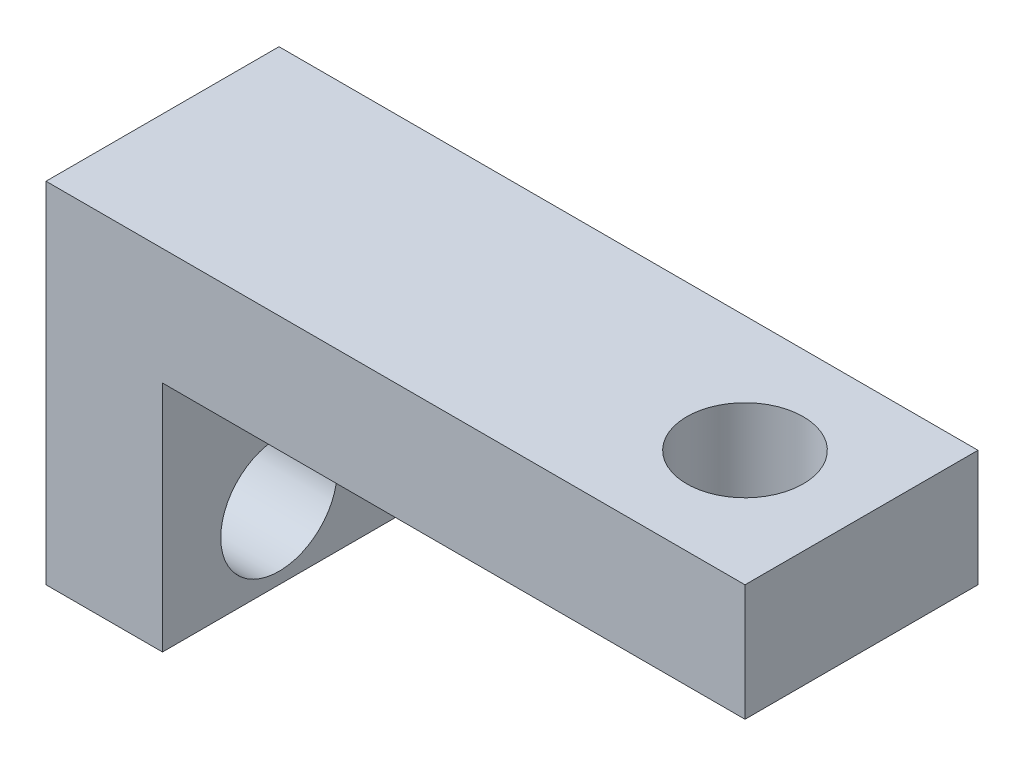
ISO-10303-21;
HEADER;
FILE_DESCRIPTION(('STEP AP214'),'2;1');
FILE_NAME('part.step','',(''),(''),'','','');
FILE_SCHEMA(('AUTOMOTIVE_DESIGN { 1 0 10303 214 1 1 1 1 }'));
ENDSEC;
DATA;
#1=APPLICATION_CONTEXT('core data for automotive mechanical design processes');
#2=APPLICATION_PROTOCOL_DEFINITION('international standard','automotive_design',2000,#1);
#3=PRODUCT_CONTEXT('',#1,'mechanical');
#4=PRODUCT('Part','Part','',(#3));
#5=PRODUCT_RELATED_PRODUCT_CATEGORY('part','',(#4));
#6=PRODUCT_DEFINITION_FORMATION('','',#4);
#7=PRODUCT_DEFINITION_CONTEXT('part definition',#1,'design');
#8=PRODUCT_DEFINITION('design','',#6,#7);
#9=PRODUCT_DEFINITION_SHAPE('','',#8);
#10=(LENGTH_UNIT() NAMED_UNIT(*) SI_UNIT(.MILLI.,.METRE.));
#11=(NAMED_UNIT(*) PLANE_ANGLE_UNIT() SI_UNIT($,.RADIAN.));
#12=(NAMED_UNIT(*) SI_UNIT($,.STERADIAN.) SOLID_ANGLE_UNIT());
#13=UNCERTAINTY_MEASURE_WITH_UNIT(LENGTH_MEASURE(1.E-05),#10,'distance_accuracy_value','');
#14=(GEOMETRIC_REPRESENTATION_CONTEXT(3) GLOBAL_UNCERTAINTY_ASSIGNED_CONTEXT((#13)) GLOBAL_UNIT_ASSIGNED_CONTEXT((#10,
#11,#12)) REPRESENTATION_CONTEXT('',''));
#15=CARTESIAN_POINT('',(0.,0.,0.));
#16=DIRECTION('',(0.,0.,1.));
#17=DIRECTION('',(1.,0.,0.));
#18=AXIS2_PLACEMENT_3D('',#15,#16,#17);
#19=CARTESIAN_POINT('',(0.,30.,-10.));
#20=DIRECTION('',(-1.,0.,0.));
#21=DIRECTION('',(0.,0.,1.));
#22=AXIS2_PLACEMENT_3D('',#19,#20,#21);
#23=PLANE('',#22);
#24=CARTESIAN_POINT('',(0.,6.,0.));
#25=DIRECTION('',(-1.,0.,0.));
#26=DIRECTION('',(0.,0.,1.));
#27=AXIS2_PLACEMENT_3D('',#24,#25,#26);
#28=CIRCLE('',#27,5.);
#29=CARTESIAN_POINT('',(0.,6.,5.));
#30=VERTEX_POINT('',#29);
#31=EDGE_CURVE('E192',#30,#30,#28,.T.);
#32=ORIENTED_EDGE('',*,*,#31,.F.);
#33=EDGE_LOOP('',(#32));
#34=FACE_BOUND('',#33,.T.);
#35=DIRECTION('',(0.,0.,1.));
#36=VECTOR('',#35,1.);
#37=CARTESIAN_POINT('',(0.,0.,-10.));
#38=LINE('',#37,#36);
#39=CARTESIAN_POINT('',(0.,0.,-10.));
#40=VERTEX_POINT('',#39);
#41=CARTESIAN_POINT('',(0.,0.,10.));
#42=VERTEX_POINT('',#41);
#43=EDGE_CURVE('E35',#40,#42,#38,.T.);
#44=ORIENTED_EDGE('',*,*,#43,.T.);
#45=DIRECTION('',(0.,-1.,0.));
#46=VECTOR('',#45,1.);
#47=CARTESIAN_POINT('',(0.,30.,10.));
#48=LINE('',#47,#46);
#49=CARTESIAN_POINT('',(0.,30.,10.));
#50=VERTEX_POINT('',#49);
#51=EDGE_CURVE('E84',#50,#42,#48,.T.);
#52=ORIENTED_EDGE('',*,*,#51,.F.);
#53=DIRECTION('',(0.,0.,1.));
#54=VECTOR('',#53,1.);
#55=CARTESIAN_POINT('',(0.,30.,-10.));
#56=LINE('',#55,#54);
#57=CARTESIAN_POINT('',(0.,30.,-10.));
#58=VERTEX_POINT('',#57);
#59=EDGE_CURVE('E11',#58,#50,#56,.T.);
#60=ORIENTED_EDGE('',*,*,#59,.F.);
#61=DIRECTION('',(0.,-1.,0.));
#62=VECTOR('',#61,1.);
#63=CARTESIAN_POINT('',(0.,30.,-10.));
#64=LINE('',#63,#62);
#65=EDGE_CURVE('E85',#58,#40,#64,.T.);
#66=ORIENTED_EDGE('',*,*,#65,.T.);
#67=EDGE_LOOP('',(#44,#52,#60,#66));
#68=FACE_BOUND('',#67,.T.);
#69=ADVANCED_FACE('F32',(#34,#68),#23,.T.);
#70=CARTESIAN_POINT('',(60.,30.,-10.));
#71=DIRECTION('',(0.,1.,0.));
#72=DIRECTION('',(-1.,0.,0.));
#73=AXIS2_PLACEMENT_3D('',#70,#71,#72);
#74=PLANE('',#73);
#75=CARTESIAN_POINT('',(50.,30.,0.));
#76=DIRECTION('',(0.,-1.,0.));
#77=DIRECTION('',(0.,0.,-1.));
#78=AXIS2_PLACEMENT_3D('',#75,#76,#77);
#79=CIRCLE('',#78,5.);
#80=CARTESIAN_POINT('',(50.,30.,-5.));
#81=VERTEX_POINT('',#80);
#82=EDGE_CURVE('E103',#81,#81,#79,.T.);
#83=ORIENTED_EDGE('',*,*,#82,.T.);
#84=EDGE_LOOP('',(#83));
#85=FACE_BOUND('',#84,.T.);
#86=ORIENTED_EDGE('',*,*,#59,.T.);
#87=DIRECTION('',(-1.,0.,0.));
#88=VECTOR('',#87,1.);
#89=CARTESIAN_POINT('',(60.,30.,10.));
#90=LINE('',#89,#88);
#91=CARTESIAN_POINT('',(60.,30.,10.));
#92=VERTEX_POINT('',#91);
#93=EDGE_CURVE('E102',#92,#50,#90,.T.);
#94=ORIENTED_EDGE('',*,*,#93,.F.);
#95=DIRECTION('',(0.,0.,1.));
#96=VECTOR('',#95,1.);
#97=CARTESIAN_POINT('',(60.,30.,-10.));
#98=LINE('',#97,#96);
#99=CARTESIAN_POINT('',(60.,30.,-10.));
#100=VERTEX_POINT('',#99);
#101=EDGE_CURVE('E40',#100,#92,#98,.T.);
#102=ORIENTED_EDGE('',*,*,#101,.F.);
#103=DIRECTION('',(-1.,0.,0.));
#104=VECTOR('',#103,1.);
#105=CARTESIAN_POINT('',(60.,30.,-10.));
#106=LINE('',#105,#104);
#107=EDGE_CURVE('E90',#100,#58,#106,.T.);
#108=ORIENTED_EDGE('',*,*,#107,.T.);
#109=EDGE_LOOP('',(#86,#94,#102,#108));
#110=FACE_BOUND('',#109,.T.);
#111=ADVANCED_FACE('F147',(#85,#110),#74,.T.);
#112=CARTESIAN_POINT('',(60.,20.,-10.));
#113=DIRECTION('',(1.,0.,0.));
#114=DIRECTION('',(0.,0.,-1.));
#115=AXIS2_PLACEMENT_3D('',#112,#113,#114);
#116=PLANE('',#115);
#117=ORIENTED_EDGE('',*,*,#101,.T.);
#118=DIRECTION('',(0.,1.,0.));
#119=VECTOR('',#118,1.);
#120=CARTESIAN_POINT('',(60.,20.,10.));
#121=LINE('',#120,#119);
#122=CARTESIAN_POINT('',(60.,20.,10.));
#123=VERTEX_POINT('',#122);
#124=EDGE_CURVE('E114',#123,#92,#121,.T.);
#125=ORIENTED_EDGE('',*,*,#124,.F.);
#126=DIRECTION('',(0.,0.,1.));
#127=VECTOR('',#126,1.);
#128=CARTESIAN_POINT('',(60.,20.,-10.));
#129=LINE('',#128,#127);
#130=CARTESIAN_POINT('',(60.,20.,-10.));
#131=VERTEX_POINT('',#130);
#132=EDGE_CURVE('E130',#131,#123,#129,.T.);
#133=ORIENTED_EDGE('',*,*,#132,.F.);
#134=DIRECTION('',(0.,1.,0.));
#135=VECTOR('',#134,1.);
#136=CARTESIAN_POINT('',(60.,20.,-10.));
#137=LINE('',#136,#135);
#138=EDGE_CURVE('E126',#131,#100,#137,.T.);
#139=ORIENTED_EDGE('',*,*,#138,.T.);
#140=EDGE_LOOP('',(#117,#125,#133,#139));
#141=FACE_BOUND('',#140,.T.);
#142=ADVANCED_FACE('F143',(#141),#116,.T.);
#143=CARTESIAN_POINT('',(10.,20.,-10.));
#144=DIRECTION('',(0.,-1.,0.));
#145=DIRECTION('',(0.,0.,-1.));
#146=AXIS2_PLACEMENT_3D('',#143,#144,#145);
#147=PLANE('',#146);
#148=CARTESIAN_POINT('',(50.,20.,0.));
#149=DIRECTION('',(0.,-1.,0.));
#150=DIRECTION('',(0.,0.,-1.));
#151=AXIS2_PLACEMENT_3D('',#148,#149,#150);
#152=CIRCLE('',#151,5.);
#153=CARTESIAN_POINT('',(50.,20.,-5.));
#154=VERTEX_POINT('',#153);
#155=EDGE_CURVE('E106',#154,#154,#152,.T.);
#156=ORIENTED_EDGE('',*,*,#155,.F.);
#157=EDGE_LOOP('',(#156));
#158=FACE_BOUND('',#157,.T.);
#159=ORIENTED_EDGE('',*,*,#132,.T.);
#160=DIRECTION('',(1.,0.,0.));
#161=VECTOR('',#160,1.);
#162=CARTESIAN_POINT('',(10.,20.,10.));
#163=LINE('',#162,#161);
#164=CARTESIAN_POINT('',(10.,20.,10.));
#165=VERTEX_POINT('',#164);
#166=EDGE_CURVE('E111',#165,#123,#163,.T.);
#167=ORIENTED_EDGE('',*,*,#166,.F.);
#168=DIRECTION('',(0.,0.,1.));
#169=VECTOR('',#168,1.);
#170=CARTESIAN_POINT('',(10.,20.,-10.));
#171=LINE('',#170,#169);
#172=CARTESIAN_POINT('',(10.,20.,-10.));
#173=VERTEX_POINT('',#172);
#174=EDGE_CURVE('E132',#173,#165,#171,.T.);
#175=ORIENTED_EDGE('',*,*,#174,.F.);
#176=DIRECTION('',(1.,0.,0.));
#177=VECTOR('',#176,1.);
#178=CARTESIAN_POINT('',(10.,20.,-10.));
#179=LINE('',#178,#177);
#180=EDGE_CURVE('E123',#173,#131,#179,.T.);
#181=ORIENTED_EDGE('',*,*,#180,.T.);
#182=EDGE_LOOP('',(#159,#167,#175,#181));
#183=FACE_BOUND('',#182,.T.);
#184=ADVANCED_FACE('F140',(#158,#183),#147,.T.);
#185=CARTESIAN_POINT('',(10.,0.,-10.));
#186=DIRECTION('',(1.,0.,0.));
#187=DIRECTION('',(0.,0.,-1.));
#188=AXIS2_PLACEMENT_3D('',#185,#186,#187);
#189=PLANE('',#188);
#190=CARTESIAN_POINT('',(10.,6.,0.));
#191=DIRECTION('',(-1.,0.,0.));
#192=DIRECTION('',(0.,0.,1.));
#193=AXIS2_PLACEMENT_3D('',#190,#191,#192);
#194=CIRCLE('',#193,5.);
#195=CARTESIAN_POINT('',(10.,6.,5.));
#196=VERTEX_POINT('',#195);
#197=EDGE_CURVE('E189',#196,#196,#194,.T.);
#198=ORIENTED_EDGE('',*,*,#197,.T.);
#199=EDGE_LOOP('',(#198));
#200=FACE_BOUND('',#199,.T.);
#201=ORIENTED_EDGE('',*,*,#174,.T.);
#202=DIRECTION('',(0.,1.,0.));
#203=VECTOR('',#202,1.);
#204=CARTESIAN_POINT('',(10.,0.,10.));
#205=LINE('',#204,#203);
#206=CARTESIAN_POINT('',(10.,0.,10.));
#207=VERTEX_POINT('',#206);
#208=EDGE_CURVE('E97',#207,#165,#205,.T.);
#209=ORIENTED_EDGE('',*,*,#208,.F.);
#210=DIRECTION('',(0.,0.,1.));
#211=VECTOR('',#210,1.);
#212=CARTESIAN_POINT('',(10.,0.,-10.));
#213=LINE('',#212,#211);
#214=CARTESIAN_POINT('',(10.,0.,-10.));
#215=VERTEX_POINT('',#214);
#216=EDGE_CURVE('E89',#215,#207,#213,.T.);
#217=ORIENTED_EDGE('',*,*,#216,.F.);
#218=DIRECTION('',(0.,1.,0.));
#219=VECTOR('',#218,1.);
#220=CARTESIAN_POINT('',(10.,0.,-10.));
#221=LINE('',#220,#219);
#222=EDGE_CURVE('E120',#215,#173,#221,.T.);
#223=ORIENTED_EDGE('',*,*,#222,.T.);
#224=EDGE_LOOP('',(#201,#209,#217,#223));
#225=FACE_BOUND('',#224,.T.);
#226=ADVANCED_FACE('F134',(#200,#225),#189,.T.);
#227=CARTESIAN_POINT('',(0.,0.,-10.));
#228=DIRECTION('',(0.,-1.,0.));
#229=DIRECTION('',(0.,0.,-1.));
#230=AXIS2_PLACEMENT_3D('',#227,#228,#229);
#231=PLANE('',#230);
#232=ORIENTED_EDGE('',*,*,#216,.T.);
#233=DIRECTION('',(1.,0.,0.));
#234=VECTOR('',#233,1.);
#235=CARTESIAN_POINT('',(0.,0.,10.));
#236=LINE('',#235,#234);
#237=EDGE_CURVE('E92',#42,#207,#236,.T.);
#238=ORIENTED_EDGE('',*,*,#237,.F.);
#239=ORIENTED_EDGE('',*,*,#43,.F.);
#240=DIRECTION('',(1.,0.,0.));
#241=VECTOR('',#240,1.);
#242=CARTESIAN_POINT('',(0.,0.,-10.));
#243=LINE('',#242,#241);
#244=EDGE_CURVE('E118',#40,#215,#243,.T.);
#245=ORIENTED_EDGE('',*,*,#244,.T.);
#246=EDGE_LOOP('',(#232,#238,#239,#245));
#247=FACE_BOUND('',#246,.T.);
#248=ADVANCED_FACE('F93',(#247),#231,.T.);
#249=CARTESIAN_POINT('',(0.,0.,-10.));
#250=DIRECTION('',(0.,0.,1.));
#251=DIRECTION('',(1.,0.,0.));
#252=AXIS2_PLACEMENT_3D('',#249,#250,#251);
#253=PLANE('',#252);
#254=ORIENTED_EDGE('',*,*,#65,.F.);
#255=ORIENTED_EDGE('',*,*,#107,.F.);
#256=ORIENTED_EDGE('',*,*,#138,.F.);
#257=ORIENTED_EDGE('',*,*,#180,.F.);
#258=ORIENTED_EDGE('',*,*,#222,.F.);
#259=ORIENTED_EDGE('',*,*,#244,.F.);
#260=EDGE_LOOP('',(#254,#255,#256,#257,#258,#259));
#261=FACE_BOUND('',#260,.T.);
#262=ADVANCED_FACE('F146',(#261),#253,.F.);
#263=CARTESIAN_POINT('',(0.,0.,10.));
#264=DIRECTION('',(0.,0.,1.));
#265=DIRECTION('',(1.,0.,0.));
#266=AXIS2_PLACEMENT_3D('',#263,#264,#265);
#267=PLANE('',#266);
#268=ORIENTED_EDGE('',*,*,#51,.T.);
#269=ORIENTED_EDGE('',*,*,#237,.T.);
#270=ORIENTED_EDGE('',*,*,#208,.T.);
#271=ORIENTED_EDGE('',*,*,#166,.T.);
#272=ORIENTED_EDGE('',*,*,#124,.T.);
#273=ORIENTED_EDGE('',*,*,#93,.T.);
#274=EDGE_LOOP('',(#268,#269,#270,#271,#272,#273));
#275=FACE_BOUND('',#274,.T.);
#276=ADVANCED_FACE('F100',(#275),#267,.T.);
#277=CARTESIAN_POINT('',(50.,30.,0.));
#278=DIRECTION('',(0.,-1.,0.));
#279=DIRECTION('',(0.,0.,-1.));
#280=AXIS2_PLACEMENT_3D('',#277,#278,#279);
#281=CYLINDRICAL_SURFACE('',#280,5.);
#282=ORIENTED_EDGE('',*,*,#82,.F.);
#283=EDGE_LOOP('',(#282));
#284=FACE_BOUND('',#283,.T.);
#285=ORIENTED_EDGE('',*,*,#155,.T.);
#286=EDGE_LOOP('',(#285));
#287=FACE_BOUND('',#286,.T.);
#288=ADVANCED_FACE('F174',(#284,#287),#281,.F.);
#289=CARTESIAN_POINT('',(10.,6.,0.));
#290=DIRECTION('',(-1.,0.,0.));
#291=DIRECTION('',(0.,0.,1.));
#292=AXIS2_PLACEMENT_3D('',#289,#290,#291);
#293=CYLINDRICAL_SURFACE('',#292,5.);
#294=ORIENTED_EDGE('',*,*,#197,.F.);
#295=EDGE_LOOP('',(#294));
#296=FACE_BOUND('',#295,.T.);
#297=ORIENTED_EDGE('',*,*,#31,.T.);
#298=EDGE_LOOP('',(#297));
#299=FACE_BOUND('',#298,.T.);
#300=ADVANCED_FACE('F178',(#296,#299),#293,.F.);
#301=CLOSED_SHELL('',(#69,#111,#142,#184,#226,#248,#262,#276,#288,#300));
#302=MANIFOLD_SOLID_BREP('B2',#301);
#303=ADVANCED_BREP_SHAPE_REPRESENTATION('',(#18,#302),#14);
#304=SHAPE_DEFINITION_REPRESENTATION(#9,#303);
ENDSEC;
END-ISO-10303-21;
